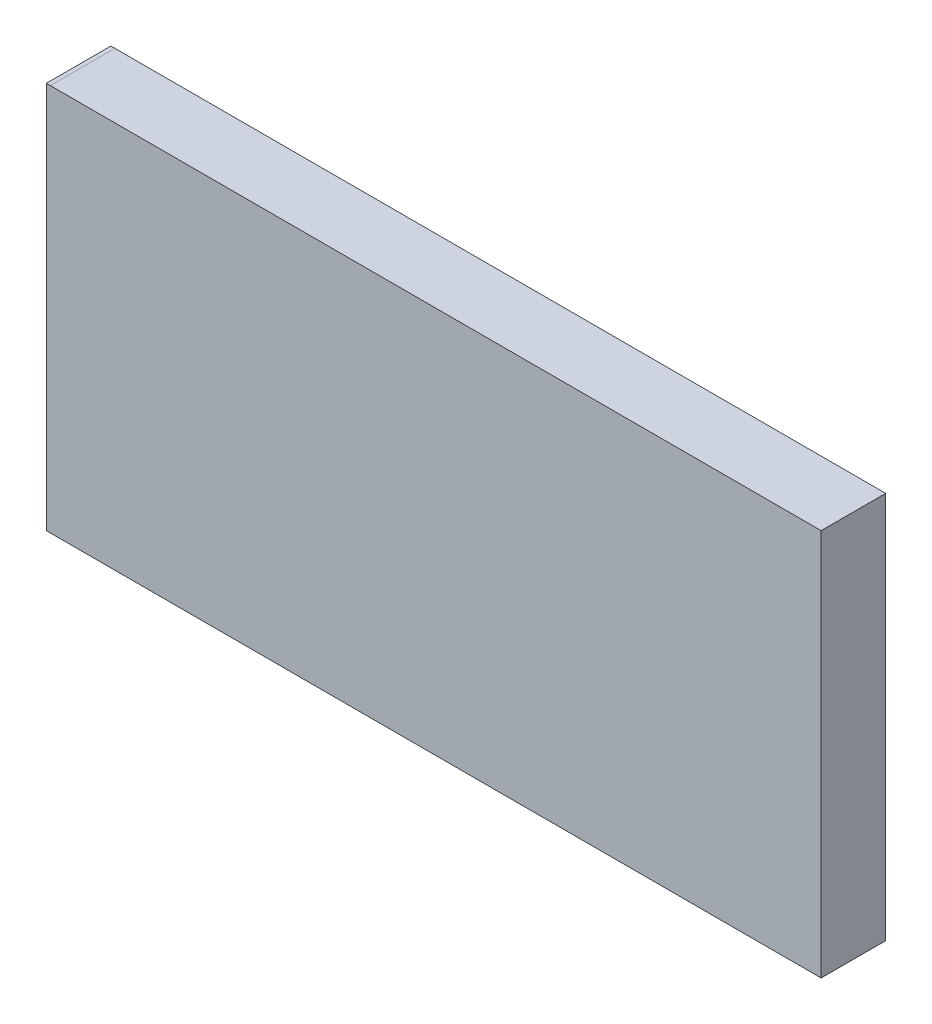
ISO-10303-21;
HEADER;
FILE_DESCRIPTION(('STEP AP214'),'2;1');
FILE_NAME('part.step','',(''),(''),'','','');
FILE_SCHEMA(('AUTOMOTIVE_DESIGN { 1 0 10303 214 1 1 1 1 }'));
ENDSEC;
DATA;
#1=APPLICATION_CONTEXT('core data for automotive mechanical design processes');
#2=APPLICATION_PROTOCOL_DEFINITION('international standard','automotive_design',2000,#1);
#3=PRODUCT_CONTEXT('',#1,'mechanical');
#4=PRODUCT('Part','Part','',(#3));
#5=PRODUCT_RELATED_PRODUCT_CATEGORY('part','',(#4));
#6=PRODUCT_DEFINITION_FORMATION('','',#4);
#7=PRODUCT_DEFINITION_CONTEXT('part definition',#1,'design');
#8=PRODUCT_DEFINITION('design','',#6,#7);
#9=PRODUCT_DEFINITION_SHAPE('','',#8);
#10=(LENGTH_UNIT() NAMED_UNIT(*) SI_UNIT(.MILLI.,.METRE.));
#11=(NAMED_UNIT(*) PLANE_ANGLE_UNIT() SI_UNIT($,.RADIAN.));
#12=(NAMED_UNIT(*) SI_UNIT($,.STERADIAN.) SOLID_ANGLE_UNIT());
#13=UNCERTAINTY_MEASURE_WITH_UNIT(LENGTH_MEASURE(1.E-05),#10,'distance_accuracy_value','');
#14=(GEOMETRIC_REPRESENTATION_CONTEXT(3) GLOBAL_UNCERTAINTY_ASSIGNED_CONTEXT((#13)) GLOBAL_UNIT_ASSIGNED_CONTEXT((#10,
#11,#12)) REPRESENTATION_CONTEXT('',''));
#15=CARTESIAN_POINT('',(0.,0.,0.));
#16=DIRECTION('',(0.,0.,1.));
#17=DIRECTION('',(1.,0.,0.));
#18=AXIS2_PLACEMENT_3D('',#15,#16,#17);
#19=CARTESIAN_POINT('',(0.,0.,12.7));
#20=DIRECTION('',(0.,-1.,0.));
#21=DIRECTION('',(0.,0.,-1.));
#22=AXIS2_PLACEMENT_3D('',#19,#20,#21);
#23=PLANE('',#22);
#24=DIRECTION('',(0.,0.,-1.));
#25=VECTOR('',#24,1.);
#26=CARTESIAN_POINT('',(0.802193967227235,0.,12.7));
#27=LINE('',#26,#25);
#28=CARTESIAN_POINT('',(0.802193967227235,0.,12.7));
#29=VERTEX_POINT('',#28);
#30=CARTESIAN_POINT('',(0.802193967227235,0.,0.));
#31=VERTEX_POINT('',#30);
#32=EDGE_CURVE('E12',#29,#31,#27,.T.);
#33=ORIENTED_EDGE('',*,*,#32,.F.);
#34=DIRECTION('',(-1.,0.,0.));
#35=VECTOR('',#34,1.);
#36=CARTESIAN_POINT('',(0.,0.,12.7));
#37=LINE('',#36,#35);
#38=CARTESIAN_POINT('',(152.4,0.,12.7));
#39=VERTEX_POINT('',#38);
#40=EDGE_CURVE('E131',#39,#29,#37,.T.);
#41=ORIENTED_EDGE('',*,*,#40,.F.);
#42=DIRECTION('',(0.,0.,-1.));
#43=VECTOR('',#42,1.);
#44=CARTESIAN_POINT('',(152.4,0.,12.7));
#45=LINE('',#44,#43);
#46=CARTESIAN_POINT('',(152.4,0.,0.));
#47=VERTEX_POINT('',#46);
#48=EDGE_CURVE('E124',#39,#47,#45,.T.);
#49=ORIENTED_EDGE('',*,*,#48,.T.);
#50=DIRECTION('',(-1.,0.,0.));
#51=VECTOR('',#50,1.);
#52=CARTESIAN_POINT('',(0.,0.,0.));
#53=LINE('',#52,#51);
#54=EDGE_CURVE('E117',#47,#31,#53,.T.);
#55=ORIENTED_EDGE('',*,*,#54,.T.);
#56=EDGE_LOOP('',(#33,#41,#49,#55));
#57=FACE_BOUND('',#56,.T.);
#58=ADVANCED_FACE('F45',(#57),#23,.F.);
#59=CARTESIAN_POINT('',(0.,-76.2,12.7));
#60=DIRECTION('',(0.,1.,0.));
#61=DIRECTION('',(0.,0.,1.));
#62=AXIS2_PLACEMENT_3D('',#59,#60,#61);
#63=PLANE('',#62);
#64=DIRECTION('',(0.,0.,-1.));
#65=VECTOR('',#64,1.);
#66=CARTESIAN_POINT('',(151.277469342873,-76.2,12.7));
#67=LINE('',#66,#65);
#68=CARTESIAN_POINT('',(151.277469342873,-76.2,12.7));
#69=VERTEX_POINT('',#68);
#70=CARTESIAN_POINT('',(151.277469342873,-76.2,0.));
#71=VERTEX_POINT('',#70);
#72=EDGE_CURVE('E54',#69,#71,#67,.T.);
#73=ORIENTED_EDGE('',*,*,#72,.F.);
#74=DIRECTION('',(1.,0.,0.));
#75=VECTOR('',#74,1.);
#76=CARTESIAN_POINT('',(0.,-76.2,12.7));
#77=LINE('',#76,#75);
#78=CARTESIAN_POINT('',(0.,-76.2,12.7));
#79=VERTEX_POINT('',#78);
#80=EDGE_CURVE('E96',#79,#69,#77,.T.);
#81=ORIENTED_EDGE('',*,*,#80,.F.);
#82=DIRECTION('',(0.,0.,-1.));
#83=VECTOR('',#82,1.);
#84=CARTESIAN_POINT('',(0.,-76.2,12.7));
#85=LINE('',#84,#83);
#86=CARTESIAN_POINT('',(0.,-76.2,0.));
#87=VERTEX_POINT('',#86);
#88=EDGE_CURVE('E101',#79,#87,#85,.T.);
#89=ORIENTED_EDGE('',*,*,#88,.T.);
#90=DIRECTION('',(1.,0.,0.));
#91=VECTOR('',#90,1.);
#92=CARTESIAN_POINT('',(0.,-76.2,0.));
#93=LINE('',#92,#91);
#94=EDGE_CURVE('E136',#87,#71,#93,.T.);
#95=ORIENTED_EDGE('',*,*,#94,.T.);
#96=EDGE_LOOP('',(#73,#81,#89,#95));
#97=FACE_BOUND('',#96,.T.);
#98=ADVANCED_FACE('F98',(#97),#63,.F.);
#99=CARTESIAN_POINT('',(0.,0.,12.7));
#100=DIRECTION('',(1.,0.,0.));
#101=DIRECTION('',(0.,1.,0.));
#102=AXIS2_PLACEMENT_3D('',#99,#100,#101);
#103=PLANE('',#102);
#104=DIRECTION('',(0.,-1.,0.));
#105=VECTOR('',#104,1.);
#106=CARTESIAN_POINT('',(0.,0.,0.));
#107=LINE('',#106,#105);
#108=CARTESIAN_POINT('',(0.,0.,0.));
#109=VERTEX_POINT('',#108);
#110=EDGE_CURVE('E119',#109,#87,#107,.T.);
#111=ORIENTED_EDGE('',*,*,#110,.T.);
#112=ORIENTED_EDGE('',*,*,#88,.F.);
#113=DIRECTION('',(0.,-1.,0.));
#114=VECTOR('',#113,1.);
#115=CARTESIAN_POINT('',(0.,0.,12.7));
#116=LINE('',#115,#114);
#117=CARTESIAN_POINT('',(0.,0.,12.7));
#118=VERTEX_POINT('',#117);
#119=EDGE_CURVE('E109',#118,#79,#116,.T.);
#120=ORIENTED_EDGE('',*,*,#119,.F.);
#121=DIRECTION('',(0.,0.,-1.));
#122=VECTOR('',#121,1.);
#123=CARTESIAN_POINT('',(0.,0.,12.7));
#124=LINE('',#123,#122);
#125=EDGE_CURVE('E129',#118,#109,#124,.T.);
#126=ORIENTED_EDGE('',*,*,#125,.T.);
#127=EDGE_LOOP('',(#111,#112,#120,#126));
#128=FACE_BOUND('',#127,.T.);
#129=ADVANCED_FACE('F47',(#128),#103,.F.);
#130=CARTESIAN_POINT('',(152.4,-76.2,12.7));
#131=VERTEX_POINT('',#130);
#132=EDGE_CURVE('E106',#69,#131,#77,.T.);
#133=ORIENTED_EDGE('',*,*,#132,.F.);
#134=ORIENTED_EDGE('',*,*,#72,.T.);
#135=CARTESIAN_POINT('',(152.4,-76.2,0.));
#136=VERTEX_POINT('',#135);
#137=EDGE_CURVE('E138',#71,#136,#93,.T.);
#138=ORIENTED_EDGE('',*,*,#137,.T.);
#139=DIRECTION('',(0.,0.,-1.));
#140=VECTOR('',#139,1.);
#141=CARTESIAN_POINT('',(152.4,-76.2,12.7));
#142=LINE('',#141,#140);
#143=EDGE_CURVE('E120',#131,#136,#142,.T.);
#144=ORIENTED_EDGE('',*,*,#143,.F.);
#145=EDGE_LOOP('',(#133,#134,#138,#144));
#146=FACE_BOUND('',#145,.T.);
#147=ADVANCED_FACE('F158',(#146),#63,.F.);
#148=CARTESIAN_POINT('',(152.4,0.,12.7));
#149=DIRECTION('',(-1.,0.,0.));
#150=DIRECTION('',(0.,0.,1.));
#151=AXIS2_PLACEMENT_3D('',#148,#149,#150);
#152=PLANE('',#151);
#153=DIRECTION('',(0.,1.,0.));
#154=VECTOR('',#153,1.);
#155=CARTESIAN_POINT('',(152.4,0.,0.));
#156=LINE('',#155,#154);
#157=EDGE_CURVE('E134',#136,#47,#156,.T.);
#158=ORIENTED_EDGE('',*,*,#157,.T.);
#159=ORIENTED_EDGE('',*,*,#48,.F.);
#160=DIRECTION('',(0.,1.,0.));
#161=VECTOR('',#160,1.);
#162=CARTESIAN_POINT('',(152.4,0.,12.7));
#163=LINE('',#162,#161);
#164=EDGE_CURVE('E105',#131,#39,#163,.T.);
#165=ORIENTED_EDGE('',*,*,#164,.F.);
#166=ORIENTED_EDGE('',*,*,#143,.T.);
#167=EDGE_LOOP('',(#158,#159,#165,#166));
#168=FACE_BOUND('',#167,.T.);
#169=ADVANCED_FACE('F147',(#168),#152,.F.);
#170=EDGE_CURVE('E112',#29,#118,#37,.T.);
#171=ORIENTED_EDGE('',*,*,#170,.F.);
#172=ORIENTED_EDGE('',*,*,#32,.T.);
#173=EDGE_CURVE('E133',#31,#109,#53,.T.);
#174=ORIENTED_EDGE('',*,*,#173,.T.);
#175=ORIENTED_EDGE('',*,*,#125,.F.);
#176=EDGE_LOOP('',(#171,#172,#174,#175));
#177=FACE_BOUND('',#176,.T.);
#178=ADVANCED_FACE('F152',(#177),#23,.F.);
#179=CARTESIAN_POINT('',(0.,0.,12.7));
#180=DIRECTION('',(0.,0.,1.));
#181=DIRECTION('',(1.,0.,0.));
#182=AXIS2_PLACEMENT_3D('',#179,#180,#181);
#183=PLANE('',#182);
#184=ORIENTED_EDGE('',*,*,#119,.T.);
#185=ORIENTED_EDGE('',*,*,#80,.T.);
#186=ORIENTED_EDGE('',*,*,#132,.T.);
#187=ORIENTED_EDGE('',*,*,#164,.T.);
#188=ORIENTED_EDGE('',*,*,#40,.T.);
#189=ORIENTED_EDGE('',*,*,#170,.T.);
#190=EDGE_LOOP('',(#184,#185,#186,#187,#188,#189));
#191=FACE_BOUND('',#190,.T.);
#192=ADVANCED_FACE('F110',(#191),#183,.T.);
#193=CARTESIAN_POINT('',(0.,0.,0.));
#194=DIRECTION('',(0.,0.,1.));
#195=DIRECTION('',(1.,0.,0.));
#196=AXIS2_PLACEMENT_3D('',#193,#194,#195);
#197=PLANE('',#196);
#198=ORIENTED_EDGE('',*,*,#110,.F.);
#199=ORIENTED_EDGE('',*,*,#173,.F.);
#200=ORIENTED_EDGE('',*,*,#54,.F.);
#201=ORIENTED_EDGE('',*,*,#157,.F.);
#202=ORIENTED_EDGE('',*,*,#137,.F.);
#203=ORIENTED_EDGE('',*,*,#94,.F.);
#204=EDGE_LOOP('',(#198,#199,#200,#201,#202,#203));
#205=FACE_BOUND('',#204,.T.);
#206=ADVANCED_FACE('F164',(#205),#197,.F.);
#207=CLOSED_SHELL('',(#58,#98,#129,#147,#169,#178,#192,#206));
#208=MANIFOLD_SOLID_BREP('B2',#207);
#209=ADVANCED_BREP_SHAPE_REPRESENTATION('',(#18,#208),#14);
#210=SHAPE_DEFINITION_REPRESENTATION(#9,#209);
ENDSEC;
END-ISO-10303-21;
